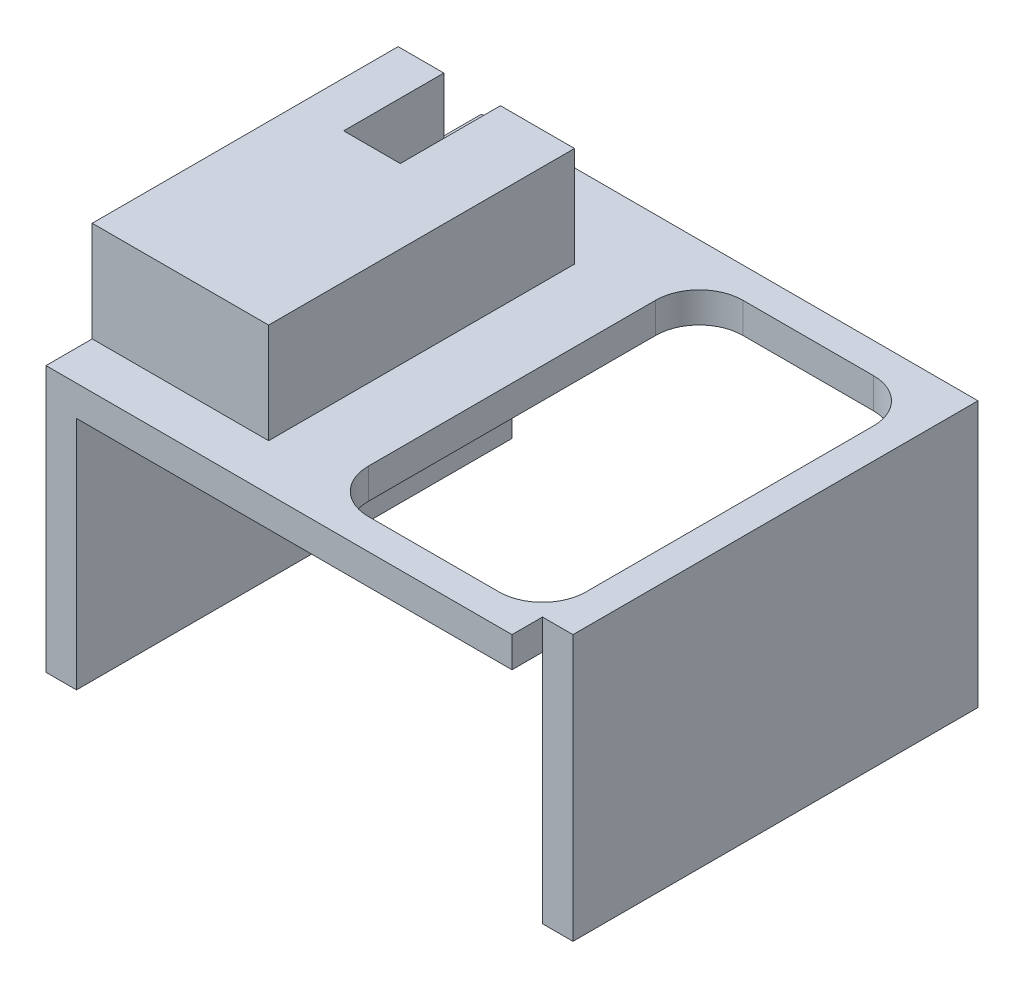
ISO-10303-21;
HEADER;
FILE_DESCRIPTION(('STEP AP214'),'2;1');
FILE_NAME('part.step','',(''),(''),'','','');
FILE_SCHEMA(('AUTOMOTIVE_DESIGN { 1 0 10303 214 1 1 1 1 }'));
ENDSEC;
DATA;
#1=APPLICATION_CONTEXT('core data for automotive mechanical design processes');
#2=APPLICATION_PROTOCOL_DEFINITION('international standard','automotive_design',2000,#1);
#3=PRODUCT_CONTEXT('',#1,'mechanical');
#4=PRODUCT('Part','Part','',(#3));
#5=PRODUCT_RELATED_PRODUCT_CATEGORY('part','',(#4));
#6=PRODUCT_DEFINITION_FORMATION('','',#4);
#7=PRODUCT_DEFINITION_CONTEXT('part definition',#1,'design');
#8=PRODUCT_DEFINITION('design','',#6,#7);
#9=PRODUCT_DEFINITION_SHAPE('','',#8);
#10=(LENGTH_UNIT() NAMED_UNIT(*) SI_UNIT(.MILLI.,.METRE.));
#11=(NAMED_UNIT(*) PLANE_ANGLE_UNIT() SI_UNIT($,.RADIAN.));
#12=(NAMED_UNIT(*) SI_UNIT($,.STERADIAN.) SOLID_ANGLE_UNIT());
#13=UNCERTAINTY_MEASURE_WITH_UNIT(LENGTH_MEASURE(1.E-05),#10,'distance_accuracy_value','');
#14=(GEOMETRIC_REPRESENTATION_CONTEXT(3) GLOBAL_UNCERTAINTY_ASSIGNED_CONTEXT((#13)) GLOBAL_UNIT_ASSIGNED_CONTEXT((#10,
#11,#12)) REPRESENTATION_CONTEXT('',''));
#15=CARTESIAN_POINT('',(0.,0.,0.));
#16=DIRECTION('',(0.,0.,1.));
#17=DIRECTION('',(1.,0.,0.));
#18=AXIS2_PLACEMENT_3D('',#15,#16,#17);
#19=CARTESIAN_POINT('',(0.,-97.0525670152918,0.));
#20=DIRECTION('',(0.,-1.,0.));
#21=DIRECTION('',(0.,0.,-1.));
#22=AXIS2_PLACEMENT_3D('',#19,#20,#21);
#23=PLANE('',#22);
#24=DIRECTION('',(-1.,0.,0.));
#25=VECTOR('',#24,1.);
#26=CARTESIAN_POINT('',(139.332830314207,-97.0525670152917,-7.));
#27=LINE('',#26,#25);
#28=CARTESIAN_POINT('',(146.332830314207,-97.0525670152917,-7.00000000000001));
#29=VERTEX_POINT('',#28);
#30=CARTESIAN_POINT('',(139.332830314207,-97.0525670152917,-7.));
#31=VERTEX_POINT('',#30);
#32=EDGE_CURVE('E86',#29,#31,#27,.T.);
#33=ORIENTED_EDGE('',*,*,#32,.T.);
#34=DIRECTION('',(0.,0.,1.));
#35=VECTOR('',#34,1.);
#36=CARTESIAN_POINT('',(139.332830314207,-97.0525670152918,0.));
#37=LINE('',#36,#35);
#38=CARTESIAN_POINT('',(139.332830314207,-97.0525670152918,-100.));
#39=VERTEX_POINT('',#38);
#40=EDGE_CURVE('E251',#39,#31,#37,.T.);
#41=ORIENTED_EDGE('',*,*,#40,.F.);
#42=DIRECTION('',(-1.,0.,0.));
#43=VECTOR('',#42,1.);
#44=CARTESIAN_POINT('',(0.,-97.0525670152918,-100.));
#45=LINE('',#44,#43);
#46=CARTESIAN_POINT('',(146.332830314207,-97.0525670152917,-100.));
#47=VERTEX_POINT('',#46);
#48=EDGE_CURVE('E387',#47,#39,#45,.T.);
#49=ORIENTED_EDGE('',*,*,#48,.F.);
#50=DIRECTION('',(0.,0.,1.));
#51=VECTOR('',#50,1.);
#52=CARTESIAN_POINT('',(146.332830314207,-97.0525670152917,-170.));
#53=LINE('',#52,#51);
#54=EDGE_CURVE('E253',#47,#29,#53,.T.);
#55=ORIENTED_EDGE('',*,*,#54,.T.);
#56=EDGE_LOOP('',(#33,#41,#49,#55));
#57=FACE_BOUND('',#56,.T.);
#58=ADVANCED_FACE('F71',(#57),#23,.T.);
#59=CARTESIAN_POINT('',(0.,-36.0525670152918,-100.));
#60=DIRECTION('',(0.,1.,0.));
#61=DIRECTION('',(0.,0.,1.));
#62=AXIS2_PLACEMENT_3D('',#59,#60,#61);
#63=PLANE('',#62);
#64=DIRECTION('',(0.,0.,1.));
#65=VECTOR('',#64,1.);
#66=CARTESIAN_POINT('',(139.332830314207,-36.0525670152918,-7.));
#67=LINE('',#66,#65);
#68=CARTESIAN_POINT('',(139.332830314207,-36.0525670152918,-7.));
#69=VERTEX_POINT('',#68);
#70=CARTESIAN_POINT('',(139.332830314207,-36.0525670152918,0.));
#71=VERTEX_POINT('',#70);
#72=EDGE_CURVE('E444',#69,#71,#67,.T.);
#73=ORIENTED_EDGE('',*,*,#72,.F.);
#74=DIRECTION('',(-1.,0.,0.));
#75=VECTOR('',#74,1.);
#76=CARTESIAN_POINT('',(139.332830314207,-36.0525670152918,-7.));
#77=LINE('',#76,#75);
#78=CARTESIAN_POINT('',(146.332830314207,-36.0525670152918,-7.));
#79=VERTEX_POINT('',#78);
#80=EDGE_CURVE('E276',#79,#69,#77,.T.);
#81=ORIENTED_EDGE('',*,*,#80,.F.);
#82=DIRECTION('',(0.,0.,1.));
#83=VECTOR('',#82,1.);
#84=CARTESIAN_POINT('',(146.332830314207,-36.0525670152918,-100.));
#85=LINE('',#84,#83);
#86=CARTESIAN_POINT('',(146.332830314207,-36.0525670152918,-100.));
#87=VERTEX_POINT('',#86);
#88=EDGE_CURVE('E288',#87,#79,#85,.T.);
#89=ORIENTED_EDGE('',*,*,#88,.F.);
#90=DIRECTION('',(-1.,0.,0.));
#91=VECTOR('',#90,1.);
#92=CARTESIAN_POINT('',(0.,-36.0525670152918,-100.));
#93=LINE('',#92,#91);
#94=CARTESIAN_POINT('',(32.3328303142074,-36.0525670152918,-100.));
#95=VERTEX_POINT('',#94);
#96=EDGE_CURVE('E283',#87,#95,#93,.T.);
#97=ORIENTED_EDGE('',*,*,#96,.T.);
#98=DIRECTION('',(0.,0.,1.));
#99=VECTOR('',#98,1.);
#100=CARTESIAN_POINT('',(32.3328303142074,-36.0525670152918,-100.));
#101=LINE('',#100,#99);
#102=CARTESIAN_POINT('',(32.3328303142074,-36.0525670152918,-80.85));
#103=VERTEX_POINT('',#102);
#104=EDGE_CURVE('E390',#95,#103,#101,.T.);
#105=ORIENTED_EDGE('',*,*,#104,.T.);
#106=DIRECTION('',(-1.,0.,0.));
#107=VECTOR('',#106,1.);
#108=CARTESIAN_POINT('',(42.8328303142074,-36.0525670152918,-80.85));
#109=LINE('',#108,#107);
#110=CARTESIAN_POINT('',(72.8328303142074,-36.0525670152918,-80.85));
#111=VERTEX_POINT('',#110);
#112=EDGE_CURVE('E378',#111,#103,#109,.T.);
#113=ORIENTED_EDGE('',*,*,#112,.F.);
#114=DIRECTION('',(0.,0.,-1.));
#115=VECTOR('',#114,1.);
#116=CARTESIAN_POINT('',(72.8328303142074,-36.0525670152918,-80.85));
#117=LINE('',#116,#115);
#118=CARTESIAN_POINT('',(72.8328303142074,-36.0525670152918,-10.6125089970561));
#119=VERTEX_POINT('',#118);
#120=EDGE_CURVE('E450',#119,#111,#117,.T.);
#121=ORIENTED_EDGE('',*,*,#120,.F.);
#122=DIRECTION('',(1.,0.,0.));
#123=VECTOR('',#122,1.);
#124=CARTESIAN_POINT('',(35.8328303142074,-36.0525670152918,-10.6125089970561));
#125=LINE('',#124,#123);
#126=CARTESIAN_POINT('',(32.3328303142074,-36.0525670152918,-10.6125089970561));
#127=VERTEX_POINT('',#126);
#128=EDGE_CURVE('E423',#127,#119,#125,.T.);
#129=ORIENTED_EDGE('',*,*,#128,.F.);
#130=CARTESIAN_POINT('',(32.3328303142074,-36.0525670152918,0.));
#131=VERTEX_POINT('',#130);
#132=EDGE_CURVE('E408',#127,#131,#101,.T.);
#133=ORIENTED_EDGE('',*,*,#132,.T.);
#134=DIRECTION('',(-1.,0.,0.));
#135=VECTOR('',#134,1.);
#136=CARTESIAN_POINT('',(0.,-36.0525670152918,0.));
#137=LINE('',#136,#135);
#138=EDGE_CURVE('E281',#71,#131,#137,.T.);
#139=ORIENTED_EDGE('',*,*,#138,.F.);
#140=EDGE_LOOP('',(#73,#81,#89,#97,#105,#113,#121,#129,#133,#139));
#141=FACE_BOUND('',#140,.T.);
#142=CARTESIAN_POINT('',(129.332830314207,-36.0525670152918,-17.));
#143=DIRECTION('',(0.,1.,0.));
#144=DIRECTION('',(0.,0.,1.));
#145=AXIS2_PLACEMENT_3D('',#142,#143,#144);
#146=CIRCLE('',#145,10.);
#147=CARTESIAN_POINT('',(139.332830314207,-36.0525670152918,-17.));
#148=VERTEX_POINT('',#147);
#149=CARTESIAN_POINT('',(129.332830314207,-36.0525670152918,-7.));
#150=VERTEX_POINT('',#149);
#151=EDGE_CURVE('E301',#148,#150,#146,.F.);
#152=ORIENTED_EDGE('',*,*,#151,.T.);
#153=DIRECTION('',(1.,0.,0.));
#154=VECTOR('',#153,1.);
#155=CARTESIAN_POINT('',(89.3328303142074,-36.0525670152918,-7.));
#156=LINE('',#155,#154);
#157=CARTESIAN_POINT('',(99.3328303142074,-36.0525670152918,-7.));
#158=VERTEX_POINT('',#157);
#159=EDGE_CURVE('E466',#158,#150,#156,.T.);
#160=ORIENTED_EDGE('',*,*,#159,.F.);
#161=CARTESIAN_POINT('',(99.3328303142074,-36.0525670152918,-17.));
#162=DIRECTION('',(0.,1.,0.));
#163=DIRECTION('',(0.,0.,1.));
#164=AXIS2_PLACEMENT_3D('',#161,#162,#163);
#165=CIRCLE('',#164,10.);
#166=CARTESIAN_POINT('',(89.3328303142074,-36.0525670152918,-17.));
#167=VERTEX_POINT('',#166);
#168=EDGE_CURVE('E291',#158,#167,#165,.F.);
#169=ORIENTED_EDGE('',*,*,#168,.T.);
#170=DIRECTION('',(0.,0.,1.));
#171=VECTOR('',#170,1.);
#172=CARTESIAN_POINT('',(89.3328303142073,-36.0525670152918,-93.));
#173=LINE('',#172,#171);
#174=CARTESIAN_POINT('',(89.3328303142073,-36.0525670152918,-83.));
#175=VERTEX_POINT('',#174);
#176=EDGE_CURVE('E460',#175,#167,#173,.T.);
#177=ORIENTED_EDGE('',*,*,#176,.F.);
#178=CARTESIAN_POINT('',(99.3328303142073,-36.0525670152918,-83.));
#179=DIRECTION('',(0.,1.,0.));
#180=DIRECTION('',(0.,0.,1.));
#181=AXIS2_PLACEMENT_3D('',#178,#179,#180);
#182=CIRCLE('',#181,10.);
#183=CARTESIAN_POINT('',(99.3328303142073,-36.0525670152918,-93.));
#184=VERTEX_POINT('',#183);
#185=EDGE_CURVE('E317',#175,#184,#182,.F.);
#186=ORIENTED_EDGE('',*,*,#185,.T.);
#187=DIRECTION('',(-1.,0.,0.));
#188=VECTOR('',#187,1.);
#189=CARTESIAN_POINT('',(89.3328303142073,-36.0525670152918,-93.));
#190=LINE('',#189,#188);
#191=CARTESIAN_POINT('',(129.332830314207,-36.0525670152918,-93.));
#192=VERTEX_POINT('',#191);
#193=EDGE_CURVE('E325',#192,#184,#190,.T.);
#194=ORIENTED_EDGE('',*,*,#193,.F.);
#195=CARTESIAN_POINT('',(129.332830314207,-36.0525670152918,-83.));
#196=DIRECTION('',(0.,1.,0.));
#197=DIRECTION('',(0.,0.,1.));
#198=AXIS2_PLACEMENT_3D('',#195,#196,#197);
#199=CIRCLE('',#198,10.);
#200=CARTESIAN_POINT('',(139.332830314207,-36.0525670152918,-83.));
#201=VERTEX_POINT('',#200);
#202=EDGE_CURVE('E79',#192,#201,#199,.F.);
#203=ORIENTED_EDGE('',*,*,#202,.T.);
#204=DIRECTION('',(0.,0.,-1.));
#205=VECTOR('',#204,1.);
#206=CARTESIAN_POINT('',(139.332830314207,-36.0525670152918,-93.));
#207=LINE('',#206,#205);
#208=EDGE_CURVE('E260',#148,#201,#207,.T.);
#209=ORIENTED_EDGE('',*,*,#208,.F.);
#210=EDGE_LOOP('',(#152,#160,#169,#177,#186,#194,#203,#209));
#211=FACE_BOUND('',#210,.T.);
#212=ADVANCED_FACE('F323',(#141,#211),#63,.T.);
#213=CARTESIAN_POINT('',(39.3328303142074,-43.0525670152918,0.));
#214=DIRECTION('',(-1.,0.,0.));
#215=DIRECTION('',(0.,-1.,0.));
#216=AXIS2_PLACEMENT_3D('',#213,#214,#215);
#217=PLANE('',#216);
#218=DIRECTION('',(0.,0.,1.));
#219=VECTOR('',#218,1.);
#220=CARTESIAN_POINT('',(39.3328303142074,-43.0525670152918,0.));
#221=LINE('',#220,#219);
#222=CARTESIAN_POINT('',(39.3328303142074,-43.0525670152918,-100.));
#223=VERTEX_POINT('',#222);
#224=CARTESIAN_POINT('',(39.3328303142074,-43.0525670152918,0.));
#225=VERTEX_POINT('',#224);
#226=EDGE_CURVE('E410',#223,#225,#221,.T.);
#227=ORIENTED_EDGE('',*,*,#226,.T.);
#228=DIRECTION('',(0.,-1.,0.));
#229=VECTOR('',#228,1.);
#230=CARTESIAN_POINT('',(39.3328303142074,-43.0525670152918,0.));
#231=LINE('',#230,#229);
#232=CARTESIAN_POINT('',(39.3328303142074,-97.0525670152918,0.));
#233=VERTEX_POINT('',#232);
#234=EDGE_CURVE('E412',#225,#233,#231,.T.);
#235=ORIENTED_EDGE('',*,*,#234,.T.);
#236=DIRECTION('',(0.,0.,1.));
#237=VECTOR('',#236,1.);
#238=CARTESIAN_POINT('',(39.3328303142074,-97.0525670152918,0.));
#239=LINE('',#238,#237);
#240=CARTESIAN_POINT('',(39.3328303142074,-97.0525670152918,-100.));
#241=VERTEX_POINT('',#240);
#242=EDGE_CURVE('E272',#241,#233,#239,.T.);
#243=ORIENTED_EDGE('',*,*,#242,.F.);
#244=DIRECTION('',(0.,-1.,0.));
#245=VECTOR('',#244,1.);
#246=CARTESIAN_POINT('',(39.3328303142074,0.,-100.));
#247=LINE('',#246,#245);
#248=EDGE_CURVE('E380',#223,#241,#247,.T.);
#249=ORIENTED_EDGE('',*,*,#248,.F.);
#250=EDGE_LOOP('',(#227,#235,#243,#249));
#251=FACE_BOUND('',#250,.T.);
#252=ADVANCED_FACE('F436',(#251),#217,.F.);
#253=CARTESIAN_POINT('',(39.3328303142074,-43.0525670152918,0.));
#254=DIRECTION('',(0.,1.,0.));
#255=DIRECTION('',(0.,0.,1.));
#256=AXIS2_PLACEMENT_3D('',#253,#254,#255);
#257=PLANE('',#256);
#258=DIRECTION('',(0.,0.,1.));
#259=VECTOR('',#258,1.);
#260=CARTESIAN_POINT('',(139.332830314207,-43.0525670152918,0.));
#261=LINE('',#260,#259);
#262=CARTESIAN_POINT('',(139.332830314207,-43.0525670152918,-17.));
#263=VERTEX_POINT('',#262);
#264=CARTESIAN_POINT('',(139.332830314207,-43.0525670152918,-7.));
#265=VERTEX_POINT('',#264);
#266=EDGE_CURVE('E340',#263,#265,#261,.T.);
#267=ORIENTED_EDGE('',*,*,#266,.T.);
#268=DIRECTION('',(0.,0.,1.));
#269=VECTOR('',#268,1.);
#270=CARTESIAN_POINT('',(139.332830314207,-43.0525670152918,0.));
#271=LINE('',#270,#269);
#272=CARTESIAN_POINT('',(139.332830314207,-43.0525670152918,0.));
#273=VERTEX_POINT('',#272);
#274=EDGE_CURVE('E246',#265,#273,#271,.T.);
#275=ORIENTED_EDGE('',*,*,#274,.T.);
#276=DIRECTION('',(-1.,0.,0.));
#277=VECTOR('',#276,1.);
#278=CARTESIAN_POINT('',(39.3328303142074,-43.0525670152918,0.));
#279=LINE('',#278,#277);
#280=EDGE_CURVE('E339',#273,#225,#279,.T.);
#281=ORIENTED_EDGE('',*,*,#280,.T.);
#282=ORIENTED_EDGE('',*,*,#226,.F.);
#283=DIRECTION('',(-1.,0.,0.));
#284=VECTOR('',#283,1.);
#285=CARTESIAN_POINT('',(0.,-43.0525670152918,-100.));
#286=LINE('',#285,#284);
#287=CARTESIAN_POINT('',(139.332830314207,-43.0525670152918,-100.));
#288=VERTEX_POINT('',#287);
#289=EDGE_CURVE('E395',#288,#223,#286,.T.);
#290=ORIENTED_EDGE('',*,*,#289,.F.);
#291=CARTESIAN_POINT('',(139.332830314207,-43.0525670152918,-83.));
#292=VERTEX_POINT('',#291);
#293=EDGE_CURVE('E93',#288,#292,#261,.T.);
#294=ORIENTED_EDGE('',*,*,#293,.T.);
#295=CARTESIAN_POINT('',(129.332830314207,-43.0525670152918,-83.));
#296=DIRECTION('',(0.,1.,0.));
#297=DIRECTION('',(0.,0.,1.));
#298=AXIS2_PLACEMENT_3D('',#295,#296,#297);
#299=CIRCLE('',#298,10.);
#300=CARTESIAN_POINT('',(129.332830314207,-43.0525670152918,-93.));
#301=VERTEX_POINT('',#300);
#302=EDGE_CURVE('E12',#292,#301,#299,.T.);
#303=ORIENTED_EDGE('',*,*,#302,.T.);
#304=DIRECTION('',(-1.,0.,0.));
#305=VECTOR('',#304,1.);
#306=CARTESIAN_POINT('',(39.3328303142074,-43.0525670152918,-93.));
#307=LINE('',#306,#305);
#308=CARTESIAN_POINT('',(99.3328303142073,-43.0525670152918,-93.));
#309=VERTEX_POINT('',#308);
#310=EDGE_CURVE('E278',#301,#309,#307,.T.);
#311=ORIENTED_EDGE('',*,*,#310,.T.);
#312=CARTESIAN_POINT('',(99.3328303142073,-43.0525670152918,-83.));
#313=DIRECTION('',(0.,1.,0.));
#314=DIRECTION('',(0.,0.,1.));
#315=AXIS2_PLACEMENT_3D('',#312,#313,#314);
#316=CIRCLE('',#315,10.);
#317=CARTESIAN_POINT('',(89.3328303142073,-43.0525670152918,-83.));
#318=VERTEX_POINT('',#317);
#319=EDGE_CURVE('E319',#309,#318,#316,.T.);
#320=ORIENTED_EDGE('',*,*,#319,.T.);
#321=DIRECTION('',(0.,0.,1.));
#322=VECTOR('',#321,1.);
#323=CARTESIAN_POINT('',(89.3328303142074,-43.0525670152918,0.));
#324=LINE('',#323,#322);
#325=CARTESIAN_POINT('',(89.3328303142074,-43.0525670152918,-17.));
#326=VERTEX_POINT('',#325);
#327=EDGE_CURVE('E267',#318,#326,#324,.T.);
#328=ORIENTED_EDGE('',*,*,#327,.T.);
#329=CARTESIAN_POINT('',(99.3328303142074,-43.0525670152918,-17.));
#330=DIRECTION('',(0.,1.,0.));
#331=DIRECTION('',(0.,0.,1.));
#332=AXIS2_PLACEMENT_3D('',#329,#330,#331);
#333=CIRCLE('',#332,10.);
#334=CARTESIAN_POINT('',(99.3328303142074,-43.0525670152918,-7.));
#335=VERTEX_POINT('',#334);
#336=EDGE_CURVE('E294',#326,#335,#333,.T.);
#337=ORIENTED_EDGE('',*,*,#336,.T.);
#338=DIRECTION('',(1.,0.,0.));
#339=VECTOR('',#338,1.);
#340=CARTESIAN_POINT('',(39.3328303142074,-43.0525670152918,-7.));
#341=LINE('',#340,#339);
#342=CARTESIAN_POINT('',(129.332830314207,-43.0525670152918,-7.));
#343=VERTEX_POINT('',#342);
#344=EDGE_CURVE('E261',#335,#343,#341,.T.);
#345=ORIENTED_EDGE('',*,*,#344,.T.);
#346=CARTESIAN_POINT('',(129.332830314207,-43.0525670152918,-17.));
#347=DIRECTION('',(0.,1.,0.));
#348=DIRECTION('',(0.,0.,1.));
#349=AXIS2_PLACEMENT_3D('',#346,#347,#348);
#350=CIRCLE('',#349,10.);
#351=EDGE_CURVE('E304',#343,#263,#350,.T.);
#352=ORIENTED_EDGE('',*,*,#351,.T.);
#353=EDGE_LOOP('',(#267,#275,#281,#282,#290,#294,#303,#311,#320,#328,#337,#345,#352));
#354=FACE_BOUND('',#353,.T.);
#355=ADVANCED_FACE('F333',(#354),#257,.F.);
#356=CARTESIAN_POINT('',(139.332830314207,-43.0525670152918,0.));
#357=DIRECTION('',(1.,0.,0.));
#358=DIRECTION('',(0.,1.,0.));
#359=AXIS2_PLACEMENT_3D('',#356,#357,#358);
#360=PLANE('',#359);
#361=ORIENTED_EDGE('',*,*,#40,.T.);
#362=DIRECTION('',(0.,1.,0.));
#363=VECTOR('',#362,1.);
#364=CARTESIAN_POINT('',(139.332830314207,-97.0525670152917,-7.));
#365=LINE('',#364,#363);
#366=EDGE_CURVE('E239',#31,#265,#365,.T.);
#367=ORIENTED_EDGE('',*,*,#366,.T.);
#368=ORIENTED_EDGE('',*,*,#266,.F.);
#369=DIRECTION('',(0.,1.,0.));
#370=VECTOR('',#369,1.);
#371=CARTESIAN_POINT('',(139.332830314207,-36.0525670152918,-17.));
#372=LINE('',#371,#370);
#373=EDGE_CURVE('E296',#263,#148,#372,.T.);
#374=ORIENTED_EDGE('',*,*,#373,.T.);
#375=ORIENTED_EDGE('',*,*,#208,.T.);
#376=DIRECTION('',(0.,1.,0.));
#377=VECTOR('',#376,1.);
#378=CARTESIAN_POINT('',(139.332830314207,-43.0525670152918,-83.));
#379=LINE('',#378,#377);
#380=EDGE_CURVE('E315',#201,#292,#379,.F.);
#381=ORIENTED_EDGE('',*,*,#380,.T.);
#382=ORIENTED_EDGE('',*,*,#293,.F.);
#383=DIRECTION('',(0.,1.,0.));
#384=VECTOR('',#383,1.);
#385=CARTESIAN_POINT('',(139.332830314207,0.,-100.));
#386=LINE('',#385,#384);
#387=EDGE_CURVE('E259',#39,#288,#386,.T.);
#388=ORIENTED_EDGE('',*,*,#387,.F.);
#389=EDGE_LOOP('',(#361,#367,#368,#374,#375,#381,#382,#388));
#390=FACE_BOUND('',#389,.T.);
#391=ADVANCED_FACE('F257',(#390),#360,.F.);
#392=CARTESIAN_POINT('',(32.3328303142074,0.,-100.));
#393=DIRECTION('',(1.,0.,0.));
#394=DIRECTION('',(0.,0.,-1.));
#395=AXIS2_PLACEMENT_3D('',#392,#393,#394);
#396=PLANE('',#395);
#397=DIRECTION('',(0.,1.,0.));
#398=VECTOR('',#397,1.);
#399=CARTESIAN_POINT('',(32.3328303142074,0.,0.));
#400=LINE('',#399,#398);
#401=CARTESIAN_POINT('',(32.3328303142074,-97.0525670152918,0.));
#402=VERTEX_POINT('',#401);
#403=EDGE_CURVE('E264',#402,#131,#400,.T.);
#404=ORIENTED_EDGE('',*,*,#403,.T.);
#405=ORIENTED_EDGE('',*,*,#132,.F.);
#406=DIRECTION('',(0.,-1.,0.));
#407=VECTOR('',#406,1.);
#408=CARTESIAN_POINT('',(32.3328303142074,-13.0525670152918,-10.6125089970561));
#409=LINE('',#408,#407);
#410=CARTESIAN_POINT('',(32.3328303142074,-13.0525670152918,-10.6125089970561));
#411=VERTEX_POINT('',#410);
#412=EDGE_CURVE('E453',#411,#127,#409,.T.);
#413=ORIENTED_EDGE('',*,*,#412,.F.);
#414=DIRECTION('',(0.,0.,1.));
#415=VECTOR('',#414,1.);
#416=CARTESIAN_POINT('',(32.3328303142074,-13.0525670152918,-80.85));
#417=LINE('',#416,#415);
#418=CARTESIAN_POINT('',(32.3328303142074,-13.0525670152918,-80.85));
#419=VERTEX_POINT('',#418);
#420=EDGE_CURVE('E355',#419,#411,#417,.T.);
#421=ORIENTED_EDGE('',*,*,#420,.F.);
#422=DIRECTION('',(0.,-1.,0.));
#423=VECTOR('',#422,1.);
#424=CARTESIAN_POINT('',(32.3328303142074,-13.0525670152918,-80.85));
#425=LINE('',#424,#423);
#426=EDGE_CURVE('E402',#419,#103,#425,.T.);
#427=ORIENTED_EDGE('',*,*,#426,.T.);
#428=ORIENTED_EDGE('',*,*,#104,.F.);
#429=DIRECTION('',(0.,1.,0.));
#430=VECTOR('',#429,1.);
#431=CARTESIAN_POINT('',(32.3328303142074,0.,-100.));
#432=LINE('',#431,#430);
#433=CARTESIAN_POINT('',(32.3328303142074,-97.0525670152918,-100.));
#434=VERTEX_POINT('',#433);
#435=EDGE_CURVE('E384',#434,#95,#432,.T.);
#436=ORIENTED_EDGE('',*,*,#435,.F.);
#437=DIRECTION('',(0.,0.,1.));
#438=VECTOR('',#437,1.);
#439=CARTESIAN_POINT('',(32.3328303142074,-97.0525670152918,-100.));
#440=LINE('',#439,#438);
#441=EDGE_CURVE('E385',#434,#402,#440,.T.);
#442=ORIENTED_EDGE('',*,*,#441,.T.);
#443=EDGE_LOOP('',(#404,#405,#413,#421,#427,#428,#436,#442));
#444=FACE_BOUND('',#443,.T.);
#445=ADVANCED_FACE('F427',(#444),#396,.F.);
#446=CARTESIAN_POINT('',(0.,0.,-100.));
#447=DIRECTION('',(0.,0.,-1.));
#448=DIRECTION('',(-1.,0.,0.));
#449=AXIS2_PLACEMENT_3D('',#446,#447,#448);
#450=PLANE('',#449);
#451=DIRECTION('',(-1.,0.,0.));
#452=VECTOR('',#451,1.);
#453=CARTESIAN_POINT('',(0.,-97.0525670152918,-100.));
#454=LINE('',#453,#452);
#455=EDGE_CURVE('E381',#241,#434,#454,.T.);
#456=ORIENTED_EDGE('',*,*,#455,.T.);
#457=ORIENTED_EDGE('',*,*,#435,.T.);
#458=ORIENTED_EDGE('',*,*,#96,.F.);
#459=DIRECTION('',(0.,1.,0.));
#460=VECTOR('',#459,1.);
#461=CARTESIAN_POINT('',(146.332830314207,0.,-100.));
#462=LINE('',#461,#460);
#463=EDGE_CURVE('E391',#47,#87,#462,.T.);
#464=ORIENTED_EDGE('',*,*,#463,.F.);
#465=ORIENTED_EDGE('',*,*,#48,.T.);
#466=ORIENTED_EDGE('',*,*,#387,.T.);
#467=ORIENTED_EDGE('',*,*,#289,.T.);
#468=ORIENTED_EDGE('',*,*,#248,.T.);
#469=EDGE_LOOP('',(#456,#457,#458,#464,#465,#466,#467,#468));
#470=FACE_BOUND('',#469,.T.);
#471=ADVANCED_FACE('F438',(#470),#450,.T.);
#472=CARTESIAN_POINT('',(42.8328303142074,-26.0525670152918,-80.85));
#473=DIRECTION('',(0.,0.,1.));
#474=DIRECTION('',(1.,0.,0.));
#475=AXIS2_PLACEMENT_3D('',#472,#473,#474);
#476=PLANE('',#475);
#477=ORIENTED_EDGE('',*,*,#112,.T.);
#478=ORIENTED_EDGE('',*,*,#426,.F.);
#479=DIRECTION('',(1.,0.,0.));
#480=VECTOR('',#479,1.);
#481=CARTESIAN_POINT('',(0.,-13.0525670152918,-80.85));
#482=LINE('',#481,#480);
#483=CARTESIAN_POINT('',(42.8328303142074,-13.0525670152918,-80.85));
#484=VERTEX_POINT('',#483);
#485=EDGE_CURVE('E347',#419,#484,#482,.T.);
#486=ORIENTED_EDGE('',*,*,#485,.T.);
#487=DIRECTION('',(0.,-1.,0.));
#488=VECTOR('',#487,1.);
#489=CARTESIAN_POINT('',(42.8328303142074,-13.0525670152918,-80.85));
#490=LINE('',#489,#488);
#491=CARTESIAN_POINT('',(42.8328303142074,-26.0525670152918,-80.85));
#492=VERTEX_POINT('',#491);
#493=EDGE_CURVE('E346',#484,#492,#490,.T.);
#494=ORIENTED_EDGE('',*,*,#493,.T.);
#495=DIRECTION('',(-1.,0.,0.));
#496=VECTOR('',#495,1.);
#497=CARTESIAN_POINT('',(42.8328303142074,-26.0525670152918,-80.85));
#498=LINE('',#497,#496);
#499=CARTESIAN_POINT('',(55.8328303142074,-26.0525670152918,-80.85));
#500=VERTEX_POINT('',#499);
#501=EDGE_CURVE('E366',#500,#492,#498,.T.);
#502=ORIENTED_EDGE('',*,*,#501,.F.);
#503=DIRECTION('',(0.,-1.,0.));
#504=VECTOR('',#503,1.);
#505=CARTESIAN_POINT('',(55.8328303142074,-13.0525670152918,-80.85));
#506=LINE('',#505,#504);
#507=CARTESIAN_POINT('',(55.8328303142074,-13.0525670152918,-80.85));
#508=VERTEX_POINT('',#507);
#509=EDGE_CURVE('E364',#508,#500,#506,.T.);
#510=ORIENTED_EDGE('',*,*,#509,.F.);
#511=CARTESIAN_POINT('',(72.8328303142074,-13.0525670152918,-80.85));
#512=VERTEX_POINT('',#511);
#513=EDGE_CURVE('E343',#508,#512,#482,.T.);
#514=ORIENTED_EDGE('',*,*,#513,.T.);
#515=DIRECTION('',(0.,-1.,0.));
#516=VECTOR('',#515,1.);
#517=CARTESIAN_POINT('',(72.8328303142074,-13.0525670152918,-80.85));
#518=LINE('',#517,#516);
#519=EDGE_CURVE('E345',#512,#111,#518,.T.);
#520=ORIENTED_EDGE('',*,*,#519,.T.);
#521=EDGE_LOOP('',(#477,#478,#486,#494,#502,#510,#514,#520));
#522=FACE_BOUND('',#521,.T.);
#523=ADVANCED_FACE('F516',(#522),#476,.F.);
#524=CARTESIAN_POINT('',(0.,-26.0525670152918,0.));
#525=DIRECTION('',(0.,1.,0.));
#526=DIRECTION('',(0.,0.,1.));
#527=AXIS2_PLACEMENT_3D('',#524,#525,#526);
#528=PLANE('',#527);
#529=DIRECTION('',(0.,0.,1.));
#530=VECTOR('',#529,1.);
#531=CARTESIAN_POINT('',(42.8328303142074,-26.0525670152918,-80.85));
#532=LINE('',#531,#530);
#533=CARTESIAN_POINT('',(42.8328303142074,-26.0525670152918,-57.85));
#534=VERTEX_POINT('',#533);
#535=EDGE_CURVE('E367',#492,#534,#532,.T.);
#536=ORIENTED_EDGE('',*,*,#535,.T.);
#537=DIRECTION('',(1.,0.,0.));
#538=VECTOR('',#537,1.);
#539=CARTESIAN_POINT('',(42.8328303142074,-26.0525670152918,-57.85));
#540=LINE('',#539,#538);
#541=CARTESIAN_POINT('',(55.8328303142074,-26.0525670152918,-57.85));
#542=VERTEX_POINT('',#541);
#543=EDGE_CURVE('E370',#534,#542,#540,.T.);
#544=ORIENTED_EDGE('',*,*,#543,.T.);
#545=DIRECTION('',(0.,0.,-1.));
#546=VECTOR('',#545,1.);
#547=CARTESIAN_POINT('',(55.8328303142074,-26.0525670152918,-80.85));
#548=LINE('',#547,#546);
#549=EDGE_CURVE('E373',#542,#500,#548,.T.);
#550=ORIENTED_EDGE('',*,*,#549,.T.);
#551=ORIENTED_EDGE('',*,*,#501,.T.);
#552=EDGE_LOOP('',(#536,#544,#550,#551));
#553=FACE_BOUND('',#552,.T.);
#554=ADVANCED_FACE('F519',(#553),#528,.T.);
#555=CARTESIAN_POINT('',(55.8328303142074,-13.0525670152918,0.));
#556=DIRECTION('',(1.,0.,0.));
#557=DIRECTION('',(0.,0.,-1.));
#558=AXIS2_PLACEMENT_3D('',#555,#556,#557);
#559=PLANE('',#558);
#560=ORIENTED_EDGE('',*,*,#549,.F.);
#561=DIRECTION('',(0.,-1.,0.));
#562=VECTOR('',#561,1.);
#563=CARTESIAN_POINT('',(55.8328303142074,-13.0525670152918,-57.85));
#564=LINE('',#563,#562);
#565=CARTESIAN_POINT('',(55.8328303142074,-13.0525670152918,-57.85));
#566=VERTEX_POINT('',#565);
#567=EDGE_CURVE('E361',#566,#542,#564,.T.);
#568=ORIENTED_EDGE('',*,*,#567,.F.);
#569=DIRECTION('',(0.,0.,1.));
#570=VECTOR('',#569,1.);
#571=CARTESIAN_POINT('',(55.8328303142074,-13.0525670152918,0.));
#572=LINE('',#571,#570);
#573=EDGE_CURVE('E348',#508,#566,#572,.T.);
#574=ORIENTED_EDGE('',*,*,#573,.F.);
#575=ORIENTED_EDGE('',*,*,#509,.T.);
#576=EDGE_LOOP('',(#560,#568,#574,#575));
#577=FACE_BOUND('',#576,.T.);
#578=ADVANCED_FACE('F523',(#577),#559,.F.);
#579=CARTESIAN_POINT('',(0.,-13.0525670152918,-57.85));
#580=DIRECTION('',(0.,0.,1.));
#581=DIRECTION('',(1.,0.,0.));
#582=AXIS2_PLACEMENT_3D('',#579,#580,#581);
#583=PLANE('',#582);
#584=ORIENTED_EDGE('',*,*,#543,.F.);
#585=DIRECTION('',(0.,-1.,0.));
#586=VECTOR('',#585,1.);
#587=CARTESIAN_POINT('',(42.8328303142074,-13.0525670152918,-57.85));
#588=LINE('',#587,#586);
#589=CARTESIAN_POINT('',(42.8328303142074,-13.0525670152918,-57.85));
#590=VERTEX_POINT('',#589);
#591=EDGE_CURVE('E358',#590,#534,#588,.T.);
#592=ORIENTED_EDGE('',*,*,#591,.F.);
#593=DIRECTION('',(-1.,0.,0.));
#594=VECTOR('',#593,1.);
#595=CARTESIAN_POINT('',(0.,-13.0525670152918,-57.85));
#596=LINE('',#595,#594);
#597=EDGE_CURVE('E350',#566,#590,#596,.T.);
#598=ORIENTED_EDGE('',*,*,#597,.F.);
#599=ORIENTED_EDGE('',*,*,#567,.T.);
#600=EDGE_LOOP('',(#584,#592,#598,#599));
#601=FACE_BOUND('',#600,.T.);
#602=ADVANCED_FACE('F527',(#601),#583,.F.);
#603=CARTESIAN_POINT('',(42.8328303142074,-13.0525670152918,0.));
#604=DIRECTION('',(-1.,0.,0.));
#605=DIRECTION('',(0.,0.,1.));
#606=AXIS2_PLACEMENT_3D('',#603,#604,#605);
#607=PLANE('',#606);
#608=ORIENTED_EDGE('',*,*,#535,.F.);
#609=ORIENTED_EDGE('',*,*,#493,.F.);
#610=DIRECTION('',(0.,0.,-1.));
#611=VECTOR('',#610,1.);
#612=CARTESIAN_POINT('',(42.8328303142074,-13.0525670152918,0.));
#613=LINE('',#612,#611);
#614=EDGE_CURVE('E353',#590,#484,#613,.T.);
#615=ORIENTED_EDGE('',*,*,#614,.F.);
#616=ORIENTED_EDGE('',*,*,#591,.T.);
#617=EDGE_LOOP('',(#608,#609,#615,#616));
#618=FACE_BOUND('',#617,.T.);
#619=ADVANCED_FACE('F531',(#618),#607,.F.);
#620=CARTESIAN_POINT('',(0.,-13.0525670152918,0.));
#621=DIRECTION('',(0.,1.,0.));
#622=DIRECTION('',(0.,0.,1.));
#623=AXIS2_PLACEMENT_3D('',#620,#621,#622);
#624=PLANE('',#623);
#625=DIRECTION('',(1.,0.,0.));
#626=VECTOR('',#625,1.);
#627=CARTESIAN_POINT('',(35.8328303142074,-13.0525670152918,-10.6125089970561));
#628=LINE('',#627,#626);
#629=CARTESIAN_POINT('',(72.8328303142074,-13.0525670152918,-10.6125089970561));
#630=VERTEX_POINT('',#629);
#631=EDGE_CURVE('E360',#411,#630,#628,.T.);
#632=ORIENTED_EDGE('',*,*,#631,.T.);
#633=DIRECTION('',(0.,0.,-1.));
#634=VECTOR('',#633,1.);
#635=CARTESIAN_POINT('',(72.8328303142074,-13.0525670152918,-80.85));
#636=LINE('',#635,#634);
#637=EDGE_CURVE('E351',#630,#512,#636,.T.);
#638=ORIENTED_EDGE('',*,*,#637,.T.);
#639=ORIENTED_EDGE('',*,*,#513,.F.);
#640=ORIENTED_EDGE('',*,*,#573,.T.);
#641=ORIENTED_EDGE('',*,*,#597,.T.);
#642=ORIENTED_EDGE('',*,*,#614,.T.);
#643=ORIENTED_EDGE('',*,*,#485,.F.);
#644=ORIENTED_EDGE('',*,*,#420,.T.);
#645=EDGE_LOOP('',(#632,#638,#639,#640,#641,#642,#643,#644));
#646=FACE_BOUND('',#645,.T.);
#647=ADVANCED_FACE('F535',(#646),#624,.T.);
#648=CARTESIAN_POINT('',(89.3328303142073,-71.0525670152918,-93.));
#649=DIRECTION('',(-1.,0.,0.));
#650=DIRECTION('',(0.,0.,1.));
#651=AXIS2_PLACEMENT_3D('',#648,#649,#650);
#652=PLANE('',#651);
#653=ORIENTED_EDGE('',*,*,#327,.F.);
#654=DIRECTION('',(0.,1.,0.));
#655=VECTOR('',#654,1.);
#656=CARTESIAN_POINT('',(89.3328303142073,-36.0525670152918,-83.));
#657=LINE('',#656,#655);
#658=EDGE_CURVE('E307',#318,#175,#657,.T.);
#659=ORIENTED_EDGE('',*,*,#658,.T.);
#660=ORIENTED_EDGE('',*,*,#176,.T.);
#661=DIRECTION('',(0.,1.,0.));
#662=VECTOR('',#661,1.);
#663=CARTESIAN_POINT('',(89.3328303142074,-43.0525670152918,-17.));
#664=LINE('',#663,#662);
#665=EDGE_CURVE('E287',#167,#326,#664,.F.);
#666=ORIENTED_EDGE('',*,*,#665,.T.);
#667=EDGE_LOOP('',(#653,#659,#660,#666));
#668=FACE_BOUND('',#667,.T.);
#669=ADVANCED_FACE('F473',(#668),#652,.F.);
#670=CARTESIAN_POINT('',(89.3328303142073,-71.0525670152918,-93.));
#671=DIRECTION('',(0.,0.,-1.));
#672=DIRECTION('',(-1.,0.,0.));
#673=AXIS2_PLACEMENT_3D('',#670,#671,#672);
#674=PLANE('',#673);
#675=ORIENTED_EDGE('',*,*,#193,.T.);
#676=DIRECTION('',(0.,1.,0.));
#677=VECTOR('',#676,1.);
#678=CARTESIAN_POINT('',(99.3328303142073,-43.0525670152918,-93.));
#679=LINE('',#678,#677);
#680=EDGE_CURVE('E313',#184,#309,#679,.F.);
#681=ORIENTED_EDGE('',*,*,#680,.T.);
#682=ORIENTED_EDGE('',*,*,#310,.F.);
#683=DIRECTION('',(0.,1.,0.));
#684=VECTOR('',#683,1.);
#685=CARTESIAN_POINT('',(129.332830314207,-36.0525670152918,-93.));
#686=LINE('',#685,#684);
#687=EDGE_CURVE('E310',#301,#192,#686,.T.);
#688=ORIENTED_EDGE('',*,*,#687,.T.);
#689=EDGE_LOOP('',(#675,#681,#682,#688));
#690=FACE_BOUND('',#689,.T.);
#691=ADVANCED_FACE('F336',(#690),#674,.F.);
#692=CARTESIAN_POINT('',(89.3328303142074,-71.0525670152918,-7.));
#693=DIRECTION('',(0.,0.,1.));
#694=DIRECTION('',(1.,0.,0.));
#695=AXIS2_PLACEMENT_3D('',#692,#693,#694);
#696=PLANE('',#695);
#697=ORIENTED_EDGE('',*,*,#159,.T.);
#698=DIRECTION('',(0.,1.,0.));
#699=VECTOR('',#698,1.);
#700=CARTESIAN_POINT('',(129.332830314207,-43.0525670152918,-7.));
#701=LINE('',#700,#699);
#702=EDGE_CURVE('E299',#150,#343,#701,.F.);
#703=ORIENTED_EDGE('',*,*,#702,.T.);
#704=ORIENTED_EDGE('',*,*,#344,.F.);
#705=DIRECTION('',(0.,1.,0.));
#706=VECTOR('',#705,1.);
#707=CARTESIAN_POINT('',(99.3328303142074,-36.0525670152918,-7.));
#708=LINE('',#707,#706);
#709=EDGE_CURVE('E284',#335,#158,#708,.T.);
#710=ORIENTED_EDGE('',*,*,#709,.T.);
#711=EDGE_LOOP('',(#697,#703,#704,#710));
#712=FACE_BOUND('',#711,.T.);
#713=ADVANCED_FACE('F483',(#712),#696,.F.);
#714=CARTESIAN_POINT('',(35.8328303142074,-13.0525670152918,-10.6125089970561));
#715=DIRECTION('',(0.,0.,-1.));
#716=DIRECTION('',(-1.,0.,0.));
#717=AXIS2_PLACEMENT_3D('',#714,#715,#716);
#718=PLANE('',#717);
#719=ORIENTED_EDGE('',*,*,#128,.T.);
#720=DIRECTION('',(0.,-1.,0.));
#721=VECTOR('',#720,1.);
#722=CARTESIAN_POINT('',(72.8328303142074,-13.0525670152918,-10.6125089970561));
#723=LINE('',#722,#721);
#724=EDGE_CURVE('E446',#630,#119,#723,.T.);
#725=ORIENTED_EDGE('',*,*,#724,.F.);
#726=ORIENTED_EDGE('',*,*,#631,.F.);
#727=ORIENTED_EDGE('',*,*,#412,.T.);
#728=EDGE_LOOP('',(#719,#725,#726,#727));
#729=FACE_BOUND('',#728,.T.);
#730=ADVANCED_FACE('F544',(#729),#718,.F.);
#731=CARTESIAN_POINT('',(72.8328303142074,-13.0525670152918,-80.85));
#732=DIRECTION('',(-1.,0.,0.));
#733=DIRECTION('',(0.,0.,1.));
#734=AXIS2_PLACEMENT_3D('',#731,#732,#733);
#735=PLANE('',#734);
#736=ORIENTED_EDGE('',*,*,#120,.T.);
#737=ORIENTED_EDGE('',*,*,#519,.F.);
#738=ORIENTED_EDGE('',*,*,#637,.F.);
#739=ORIENTED_EDGE('',*,*,#724,.T.);
#740=EDGE_LOOP('',(#736,#737,#738,#739));
#741=FACE_BOUND('',#740,.T.);
#742=ADVANCED_FACE('F549',(#741),#735,.F.);
#743=CARTESIAN_POINT('',(0.,-97.0525670152918,-180.000025));
#744=DIRECTION('',(0.,1.,0.));
#745=DIRECTION('',(0.,0.,1.));
#746=AXIS2_PLACEMENT_3D('',#743,#744,#745);
#747=PLANE('',#746);
#748=ORIENTED_EDGE('',*,*,#242,.T.);
#749=DIRECTION('',(-1.,0.,0.));
#750=VECTOR('',#749,1.);
#751=CARTESIAN_POINT('',(0.,-97.0525670152918,0.));
#752=LINE('',#751,#750);
#753=EDGE_CURVE('E275',#233,#402,#752,.T.);
#754=ORIENTED_EDGE('',*,*,#753,.T.);
#755=ORIENTED_EDGE('',*,*,#441,.F.);
#756=ORIENTED_EDGE('',*,*,#455,.F.);
#757=EDGE_LOOP('',(#748,#754,#755,#756));
#758=FACE_BOUND('',#757,.T.);
#759=ADVANCED_FACE('F434',(#758),#747,.F.);
#760=CARTESIAN_POINT('',(-129.667169685793,-104.052567015292,0.));
#761=DIRECTION('',(0.,0.,-1.));
#762=DIRECTION('',(-1.,0.,0.));
#763=AXIS2_PLACEMENT_3D('',#760,#761,#762);
#764=PLANE('',#763);
#765=ORIENTED_EDGE('',*,*,#280,.F.);
#766=DIRECTION('',(0.,1.,0.));
#767=VECTOR('',#766,1.);
#768=CARTESIAN_POINT('',(139.332830314207,-97.0525670152917,0.));
#769=LINE('',#768,#767);
#770=EDGE_CURVE('E254',#273,#71,#769,.T.);
#771=ORIENTED_EDGE('',*,*,#770,.T.);
#772=ORIENTED_EDGE('',*,*,#138,.T.);
#773=ORIENTED_EDGE('',*,*,#403,.F.);
#774=ORIENTED_EDGE('',*,*,#753,.F.);
#775=ORIENTED_EDGE('',*,*,#234,.F.);
#776=EDGE_LOOP('',(#765,#771,#772,#773,#774,#775));
#777=FACE_BOUND('',#776,.T.);
#778=ADVANCED_FACE('F431',(#777),#764,.F.);
#779=CARTESIAN_POINT('',(146.332830314207,-97.0525670152917,-170.));
#780=DIRECTION('',(-1.,0.,0.));
#781=DIRECTION('',(0.,0.,1.));
#782=AXIS2_PLACEMENT_3D('',#779,#780,#781);
#783=PLANE('',#782);
#784=ORIENTED_EDGE('',*,*,#88,.T.);
#785=DIRECTION('',(0.,1.,0.));
#786=VECTOR('',#785,1.);
#787=CARTESIAN_POINT('',(146.332830314207,-97.0525670152917,-7.));
#788=LINE('',#787,#786);
#789=EDGE_CURVE('E786',#29,#79,#788,.T.);
#790=ORIENTED_EDGE('',*,*,#789,.F.);
#791=ORIENTED_EDGE('',*,*,#54,.F.);
#792=ORIENTED_EDGE('',*,*,#463,.T.);
#793=EDGE_LOOP('',(#784,#790,#791,#792));
#794=FACE_BOUND('',#793,.T.);
#795=ADVANCED_FACE('F494',(#794),#783,.F.);
#796=CARTESIAN_POINT('',(99.3328303142074,-71.0525670152918,-17.));
#797=DIRECTION('',(0.,-1.,0.));
#798=DIRECTION('',(0.,0.,-1.));
#799=AXIS2_PLACEMENT_3D('',#796,#797,#798);
#800=CYLINDRICAL_SURFACE('',#799,10.);
#801=ORIENTED_EDGE('',*,*,#336,.F.);
#802=ORIENTED_EDGE('',*,*,#665,.F.);
#803=ORIENTED_EDGE('',*,*,#168,.F.);
#804=ORIENTED_EDGE('',*,*,#709,.F.);
#805=EDGE_LOOP('',(#801,#802,#803,#804));
#806=FACE_BOUND('',#805,.T.);
#807=ADVANCED_FACE('F479',(#806),#800,.F.);
#808=CARTESIAN_POINT('',(129.332830314207,-43.0525670152918,-17.));
#809=DIRECTION('',(0.,-1.,0.));
#810=DIRECTION('',(1.,0.,0.));
#811=AXIS2_PLACEMENT_3D('',#808,#809,#810);
#812=CYLINDRICAL_SURFACE('',#811,10.);
#813=ORIENTED_EDGE('',*,*,#351,.F.);
#814=ORIENTED_EDGE('',*,*,#702,.F.);
#815=ORIENTED_EDGE('',*,*,#151,.F.);
#816=ORIENTED_EDGE('',*,*,#373,.F.);
#817=EDGE_LOOP('',(#813,#814,#815,#816));
#818=FACE_BOUND('',#817,.T.);
#819=ADVANCED_FACE('F487',(#818),#812,.F.);
#820=CARTESIAN_POINT('',(99.3328303142073,-71.0525670152918,-83.));
#821=DIRECTION('',(0.,-1.,0.));
#822=DIRECTION('',(0.,0.,-1.));
#823=AXIS2_PLACEMENT_3D('',#820,#821,#822);
#824=CYLINDRICAL_SURFACE('',#823,10.);
#825=ORIENTED_EDGE('',*,*,#319,.F.);
#826=ORIENTED_EDGE('',*,*,#680,.F.);
#827=ORIENTED_EDGE('',*,*,#185,.F.);
#828=ORIENTED_EDGE('',*,*,#658,.F.);
#829=EDGE_LOOP('',(#825,#826,#827,#828));
#830=FACE_BOUND('',#829,.T.);
#831=ADVANCED_FACE('F469',(#830),#824,.F.);
#832=CARTESIAN_POINT('',(129.332830314207,-71.0525670152918,-83.));
#833=DIRECTION('',(0.,-1.,0.));
#834=DIRECTION('',(1.,0.,0.));
#835=AXIS2_PLACEMENT_3D('',#832,#833,#834);
#836=CYLINDRICAL_SURFACE('',#835,10.);
#837=ORIENTED_EDGE('',*,*,#302,.F.);
#838=ORIENTED_EDGE('',*,*,#380,.F.);
#839=ORIENTED_EDGE('',*,*,#202,.F.);
#840=ORIENTED_EDGE('',*,*,#687,.F.);
#841=EDGE_LOOP('',(#837,#838,#839,#840));
#842=FACE_BOUND('',#841,.T.);
#843=ADVANCED_FACE('F73',(#842),#836,.F.);
#844=CARTESIAN_POINT('',(139.332830314207,-97.0525670152917,-7.));
#845=DIRECTION('',(-1.,0.,0.));
#846=DIRECTION('',(0.,0.,1.));
#847=AXIS2_PLACEMENT_3D('',#844,#845,#846);
#848=PLANE('',#847);
#849=ORIENTED_EDGE('',*,*,#72,.T.);
#850=ORIENTED_EDGE('',*,*,#770,.F.);
#851=ORIENTED_EDGE('',*,*,#274,.F.);
#852=EDGE_CURVE('E242',#265,#69,#365,.T.);
#853=ORIENTED_EDGE('',*,*,#852,.T.);
#854=EDGE_LOOP('',(#849,#850,#851,#853));
#855=FACE_BOUND('',#854,.T.);
#856=ADVANCED_FACE('F558',(#855),#848,.F.);
#857=CARTESIAN_POINT('',(139.332830314207,-97.0525670152917,-7.));
#858=DIRECTION('',(0.,0.,-1.));
#859=DIRECTION('',(-1.,0.,0.));
#860=AXIS2_PLACEMENT_3D('',#857,#858,#859);
#861=PLANE('',#860);
#862=ORIENTED_EDGE('',*,*,#80,.T.);
#863=ORIENTED_EDGE('',*,*,#852,.F.);
#864=ORIENTED_EDGE('',*,*,#366,.F.);
#865=ORIENTED_EDGE('',*,*,#32,.F.);
#866=ORIENTED_EDGE('',*,*,#789,.T.);
#867=EDGE_LOOP('',(#862,#863,#864,#865,#866));
#868=FACE_BOUND('',#867,.T.);
#869=ADVANCED_FACE('F240',(#868),#861,.F.);
#870=CLOSED_SHELL('',(#58,#212,#252,#355,#391,#445,#471,#523,#554,#578,#602,#619,#647,#669,#691,
#713,#730,#742,#759,#778,#795,#807,#819,#831,#843,#856,#869));
#871=MANIFOLD_SOLID_BREP('B2',#870);
#872=ADVANCED_BREP_SHAPE_REPRESENTATION('',(#18,#871),#14);
#873=SHAPE_DEFINITION_REPRESENTATION(#9,#872);
ENDSEC;
END-ISO-10303-21;
